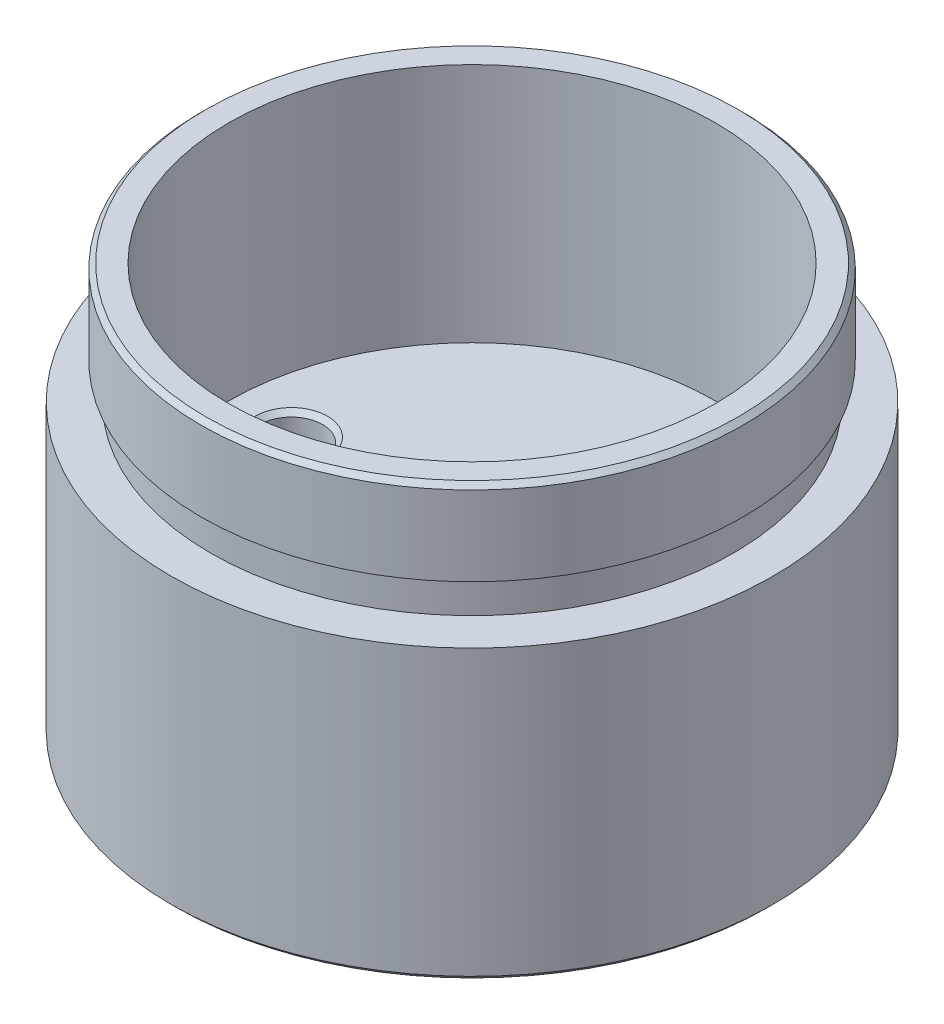
ISO-10303-21;
HEADER;
FILE_DESCRIPTION(('STEP AP214'),'2;1');
FILE_NAME('part.step','',(''),(''),'','','');
FILE_SCHEMA(('AUTOMOTIVE_DESIGN { 1 0 10303 214 1 1 1 1 }'));
ENDSEC;
DATA;
#1=APPLICATION_CONTEXT('core data for automotive mechanical design processes');
#2=APPLICATION_PROTOCOL_DEFINITION('international standard','automotive_design',2000,#1);
#3=PRODUCT_CONTEXT('',#1,'mechanical');
#4=PRODUCT('Part','Part','',(#3));
#5=PRODUCT_RELATED_PRODUCT_CATEGORY('part','',(#4));
#6=PRODUCT_DEFINITION_FORMATION('','',#4);
#7=PRODUCT_DEFINITION_CONTEXT('part definition',#1,'design');
#8=PRODUCT_DEFINITION('design','',#6,#7);
#9=PRODUCT_DEFINITION_SHAPE('','',#8);
#10=(LENGTH_UNIT() NAMED_UNIT(*) SI_UNIT(.MILLI.,.METRE.));
#11=(NAMED_UNIT(*) PLANE_ANGLE_UNIT() SI_UNIT($,.RADIAN.));
#12=(NAMED_UNIT(*) SI_UNIT($,.STERADIAN.) SOLID_ANGLE_UNIT());
#13=UNCERTAINTY_MEASURE_WITH_UNIT(LENGTH_MEASURE(1.E-05),#10,'distance_accuracy_value','');
#14=(GEOMETRIC_REPRESENTATION_CONTEXT(3) GLOBAL_UNCERTAINTY_ASSIGNED_CONTEXT((#13)) GLOBAL_UNIT_ASSIGNED_CONTEXT((#10,
#11,#12)) REPRESENTATION_CONTEXT('',''));
#15=CARTESIAN_POINT('',(0.,0.,0.));
#16=DIRECTION('',(0.,0.,1.));
#17=DIRECTION('',(1.,0.,0.));
#18=AXIS2_PLACEMENT_3D('',#15,#16,#17);
#19=CARTESIAN_POINT('',(0.,12.,0.));
#20=DIRECTION('',(0.,1.,0.));
#21=DIRECTION('',(0.,0.,1.));
#22=AXIS2_PLACEMENT_3D('',#19,#20,#21);
#23=CYLINDRICAL_SURFACE('',#22,10.85);
#24=CARTESIAN_POINT('',(0.,12.,0.));
#25=DIRECTION('',(0.,1.,0.));
#26=DIRECTION('',(0.,0.,1.));
#27=AXIS2_PLACEMENT_3D('',#24,#25,#26);
#28=CIRCLE('',#27,10.85);
#29=CARTESIAN_POINT('',(0.,12.,10.85));
#30=VERTEX_POINT('',#29);
#31=EDGE_CURVE('E87',#30,#30,#28,.T.);
#32=ORIENTED_EDGE('',*,*,#31,.T.);
#33=EDGE_LOOP('',(#32));
#34=FACE_BOUND('',#33,.T.);
#35=CARTESIAN_POINT('',(0.,13.5,0.));
#36=DIRECTION('',(0.,1.,0.));
#37=DIRECTION('',(0.,0.,1.));
#38=AXIS2_PLACEMENT_3D('',#35,#36,#37);
#39=CIRCLE('',#38,10.85);
#40=CARTESIAN_POINT('',(0.,13.5,10.85));
#41=VERTEX_POINT('',#40);
#42=EDGE_CURVE('E93',#41,#41,#39,.T.);
#43=ORIENTED_EDGE('',*,*,#42,.F.);
#44=EDGE_LOOP('',(#43));
#45=FACE_BOUND('',#44,.T.);
#46=ADVANCED_FACE('F34',(#34,#45),#23,.T.);
#47=CARTESIAN_POINT('',(0.,17.,0.));
#48=DIRECTION('',(0.,-1.,0.));
#49=DIRECTION('',(0.,0.,-1.));
#50=AXIS2_PLACEMENT_3D('',#47,#48,#49);
#51=CYLINDRICAL_SURFACE('',#50,12.5);
#52=CARTESIAN_POINT('',(0.,0.199999999999995,0.));
#53=DIRECTION('',(0.,1.,0.));
#54=DIRECTION('',(0.,0.,1.));
#55=AXIS2_PLACEMENT_3D('',#52,#53,#54);
#56=CIRCLE('',#55,12.5);
#57=CARTESIAN_POINT('',(0.,0.199999999999995,12.5));
#58=VERTEX_POINT('',#57);
#59=EDGE_CURVE('E45',#58,#58,#56,.T.);
#60=ORIENTED_EDGE('',*,*,#59,.T.);
#61=EDGE_LOOP('',(#60));
#62=FACE_BOUND('',#61,.T.);
#63=CARTESIAN_POINT('',(0.,12.,0.));
#64=DIRECTION('',(0.,1.,0.));
#65=DIRECTION('',(0.,0.,1.));
#66=AXIS2_PLACEMENT_3D('',#63,#64,#65);
#67=CIRCLE('',#66,12.5);
#68=CARTESIAN_POINT('',(0.,12.,12.5));
#69=VERTEX_POINT('',#68);
#70=EDGE_CURVE('E82',#69,#69,#67,.T.);
#71=ORIENTED_EDGE('',*,*,#70,.F.);
#72=EDGE_LOOP('',(#71));
#73=FACE_BOUND('',#72,.T.);
#74=ADVANCED_FACE('F101',(#62,#73),#51,.T.);
#75=CARTESIAN_POINT('',(0.,17.,0.));
#76=DIRECTION('',(0.,1.,0.));
#77=DIRECTION('',(0.,0.,1.));
#78=AXIS2_PLACEMENT_3D('',#75,#76,#77);
#79=PLANE('',#78);
#80=CARTESIAN_POINT('',(0.,17.,0.));
#81=DIRECTION('',(0.,1.,0.));
#82=DIRECTION('',(0.,0.,1.));
#83=AXIS2_PLACEMENT_3D('',#80,#81,#82);
#84=CIRCLE('',#83,11.05);
#85=CARTESIAN_POINT('',(0.,17.,11.05));
#86=VERTEX_POINT('',#85);
#87=EDGE_CURVE('E41',#86,#86,#84,.T.);
#88=ORIENTED_EDGE('',*,*,#87,.T.);
#89=EDGE_LOOP('',(#88));
#90=FACE_BOUND('',#89,.T.);
#91=CARTESIAN_POINT('',(0.,17.,0.));
#92=DIRECTION('',(0.,1.,0.));
#93=DIRECTION('',(0.,0.,1.));
#94=AXIS2_PLACEMENT_3D('',#91,#92,#93);
#95=CIRCLE('',#94,10.1);
#96=CARTESIAN_POINT('',(0.,17.,10.1));
#97=VERTEX_POINT('',#96);
#98=EDGE_CURVE('E79',#97,#97,#95,.T.);
#99=ORIENTED_EDGE('',*,*,#98,.F.);
#100=EDGE_LOOP('',(#99));
#101=FACE_BOUND('',#100,.T.);
#102=ADVANCED_FACE('F107',(#90,#101),#79,.T.);
#103=CARTESIAN_POINT('',(0.,0.,0.));
#104=DIRECTION('',(0.,1.,0.));
#105=DIRECTION('',(0.,0.,1.));
#106=AXIS2_PLACEMENT_3D('',#103,#104,#105);
#107=PLANE('',#106);
#108=CARTESIAN_POINT('',(7.5,0.,0.));
#109=DIRECTION('',(0.,1.,0.));
#110=DIRECTION('',(0.,0.,1.));
#111=AXIS2_PLACEMENT_3D('',#108,#109,#110);
#112=CIRCLE('',#111,1.5);
#113=CARTESIAN_POINT('',(7.5,0.,1.5));
#114=VERTEX_POINT('',#113);
#115=EDGE_CURVE('E49',#114,#114,#112,.T.);
#116=ORIENTED_EDGE('',*,*,#115,.T.);
#117=EDGE_LOOP('',(#116));
#118=FACE_BOUND('',#117,.T.);
#119=CARTESIAN_POINT('',(-7.5,0.,0.));
#120=DIRECTION('',(0.,1.,0.));
#121=DIRECTION('',(0.,0.,1.));
#122=AXIS2_PLACEMENT_3D('',#119,#120,#121);
#123=CIRCLE('',#122,1.5);
#124=CARTESIAN_POINT('',(-7.5,0.,1.5));
#125=VERTEX_POINT('',#124);
#126=EDGE_CURVE('E54',#125,#125,#123,.T.);
#127=ORIENTED_EDGE('',*,*,#126,.T.);
#128=EDGE_LOOP('',(#127));
#129=FACE_BOUND('',#128,.T.);
#130=CARTESIAN_POINT('',(0.,0.,0.));
#131=DIRECTION('',(0.,1.,0.));
#132=DIRECTION('',(0.,0.,1.));
#133=AXIS2_PLACEMENT_3D('',#130,#131,#132);
#134=CIRCLE('',#133,12.3);
#135=CARTESIAN_POINT('',(0.,0.,12.3));
#136=VERTEX_POINT('',#135);
#137=EDGE_CURVE('E57',#136,#136,#134,.F.);
#138=ORIENTED_EDGE('',*,*,#137,.T.);
#139=EDGE_LOOP('',(#138));
#140=FACE_BOUND('',#139,.T.);
#141=ADVANCED_FACE('F133',(#118,#129,#140),#107,.F.);
#142=CARTESIAN_POINT('',(0.,7.,0.));
#143=DIRECTION('',(0.,1.,0.));
#144=DIRECTION('',(0.,0.,1.));
#145=AXIS2_PLACEMENT_3D('',#142,#143,#144);
#146=CYLINDRICAL_SURFACE('',#145,10.1);
#147=CARTESIAN_POINT('',(0.,7.,0.));
#148=DIRECTION('',(0.,1.,0.));
#149=DIRECTION('',(0.,0.,1.));
#150=AXIS2_PLACEMENT_3D('',#147,#148,#149);
#151=CIRCLE('',#150,10.1);
#152=CARTESIAN_POINT('',(0.,7.,10.1));
#153=VERTEX_POINT('',#152);
#154=EDGE_CURVE('E78',#153,#153,#151,.T.);
#155=ORIENTED_EDGE('',*,*,#154,.F.);
#156=EDGE_LOOP('',(#155));
#157=FACE_BOUND('',#156,.T.);
#158=ORIENTED_EDGE('',*,*,#98,.T.);
#159=EDGE_LOOP('',(#158));
#160=FACE_BOUND('',#159,.T.);
#161=ADVANCED_FACE('F129',(#157,#160),#146,.F.);
#162=CARTESIAN_POINT('',(0.,7.,0.));
#163=DIRECTION('',(0.,1.,0.));
#164=DIRECTION('',(0.,0.,1.));
#165=AXIS2_PLACEMENT_3D('',#162,#163,#164);
#166=PLANE('',#165);
#167=CARTESIAN_POINT('',(-7.5,7.,0.));
#168=DIRECTION('',(0.,1.,0.));
#169=DIRECTION('',(0.,0.,1.));
#170=AXIS2_PLACEMENT_3D('',#167,#168,#169);
#171=CIRCLE('',#170,1.5);
#172=CARTESIAN_POINT('',(-7.5,7.,1.5));
#173=VERTEX_POINT('',#172);
#174=EDGE_CURVE('E66',#173,#173,#171,.F.);
#175=ORIENTED_EDGE('',*,*,#174,.T.);
#176=EDGE_LOOP('',(#175));
#177=FACE_BOUND('',#176,.T.);
#178=CARTESIAN_POINT('',(7.5,7.,0.));
#179=DIRECTION('',(0.,1.,0.));
#180=DIRECTION('',(0.,0.,1.));
#181=AXIS2_PLACEMENT_3D('',#178,#179,#180);
#182=CIRCLE('',#181,1.5);
#183=CARTESIAN_POINT('',(7.5,7.,1.5));
#184=VERTEX_POINT('',#183);
#185=EDGE_CURVE('E69',#184,#184,#182,.F.);
#186=ORIENTED_EDGE('',*,*,#185,.T.);
#187=EDGE_LOOP('',(#186));
#188=FACE_BOUND('',#187,.T.);
#189=ORIENTED_EDGE('',*,*,#154,.T.);
#190=EDGE_LOOP('',(#189));
#191=FACE_BOUND('',#190,.T.);
#192=ADVANCED_FACE('F125',(#177,#188,#191),#166,.T.);
#193=CARTESIAN_POINT('',(7.5,-3.,0.));
#194=DIRECTION('',(0.,1.,0.));
#195=DIRECTION('',(0.,0.,1.));
#196=AXIS2_PLACEMENT_3D('',#193,#194,#195);
#197=CYLINDRICAL_SURFACE('',#196,1.3);
#198=CARTESIAN_POINT('',(7.5,6.8,0.));
#199=DIRECTION('',(0.,1.,0.));
#200=DIRECTION('',(0.,0.,1.));
#201=AXIS2_PLACEMENT_3D('',#198,#199,#200);
#202=CIRCLE('',#201,1.3);
#203=CARTESIAN_POINT('',(7.5,6.8,1.3));
#204=VERTEX_POINT('',#203);
#205=EDGE_CURVE('E60',#204,#204,#202,.T.);
#206=ORIENTED_EDGE('',*,*,#205,.T.);
#207=EDGE_LOOP('',(#206));
#208=FACE_BOUND('',#207,.T.);
#209=CARTESIAN_POINT('',(7.5,0.199999999999997,0.));
#210=DIRECTION('',(0.,1.,0.));
#211=DIRECTION('',(0.,0.,1.));
#212=AXIS2_PLACEMENT_3D('',#209,#210,#211);
#213=CIRCLE('',#212,1.3);
#214=CARTESIAN_POINT('',(7.5,0.199999999999997,1.3));
#215=VERTEX_POINT('',#214);
#216=EDGE_CURVE('E63',#215,#215,#213,.F.);
#217=ORIENTED_EDGE('',*,*,#216,.T.);
#218=EDGE_LOOP('',(#217));
#219=FACE_BOUND('',#218,.T.);
#220=ADVANCED_FACE('F121',(#208,#219),#197,.F.);
#221=CARTESIAN_POINT('',(-7.5,-3.,0.));
#222=DIRECTION('',(0.,1.,0.));
#223=DIRECTION('',(0.,0.,1.));
#224=AXIS2_PLACEMENT_3D('',#221,#222,#223);
#225=CYLINDRICAL_SURFACE('',#224,1.3);
#226=CARTESIAN_POINT('',(-7.5,6.8,0.));
#227=DIRECTION('',(0.,1.,0.));
#228=DIRECTION('',(0.,0.,1.));
#229=AXIS2_PLACEMENT_3D('',#226,#227,#228);
#230=CIRCLE('',#229,1.3);
#231=CARTESIAN_POINT('',(-7.5,6.8,1.3));
#232=VERTEX_POINT('',#231);
#233=EDGE_CURVE('E72',#232,#232,#230,.T.);
#234=ORIENTED_EDGE('',*,*,#233,.T.);
#235=EDGE_LOOP('',(#234));
#236=FACE_BOUND('',#235,.T.);
#237=CARTESIAN_POINT('',(-7.5,0.199999999999997,0.));
#238=DIRECTION('',(0.,1.,0.));
#239=DIRECTION('',(0.,0.,1.));
#240=AXIS2_PLACEMENT_3D('',#237,#238,#239);
#241=CIRCLE('',#240,1.3);
#242=CARTESIAN_POINT('',(-7.5,0.199999999999997,1.3));
#243=VERTEX_POINT('',#242);
#244=EDGE_CURVE('E75',#243,#243,#241,.F.);
#245=ORIENTED_EDGE('',*,*,#244,.T.);
#246=EDGE_LOOP('',(#245));
#247=FACE_BOUND('',#246,.T.);
#248=ADVANCED_FACE('F117',(#236,#247),#225,.F.);
#249=CARTESIAN_POINT('',(0.,12.,0.));
#250=DIRECTION('',(0.,1.,0.));
#251=DIRECTION('',(0.,0.,1.));
#252=AXIS2_PLACEMENT_3D('',#249,#250,#251);
#253=PLANE('',#252);
#254=ORIENTED_EDGE('',*,*,#31,.F.);
#255=EDGE_LOOP('',(#254));
#256=FACE_BOUND('',#255,.T.);
#257=ORIENTED_EDGE('',*,*,#70,.T.);
#258=EDGE_LOOP('',(#257));
#259=FACE_BOUND('',#258,.T.);
#260=ADVANCED_FACE('F114',(#256,#259),#253,.T.);
#261=CARTESIAN_POINT('',(0.,13.5,0.));
#262=DIRECTION('',(0.,1.,0.));
#263=DIRECTION('',(0.,0.,1.));
#264=AXIS2_PLACEMENT_3D('',#261,#262,#263);
#265=CYLINDRICAL_SURFACE('',#264,11.25);
#266=CARTESIAN_POINT('',(0.,16.8,0.));
#267=DIRECTION('',(0.,1.,0.));
#268=DIRECTION('',(0.,0.,1.));
#269=AXIS2_PLACEMENT_3D('',#266,#267,#268);
#270=CIRCLE('',#269,11.25);
#271=CARTESIAN_POINT('',(0.,16.8,11.25));
#272=VERTEX_POINT('',#271);
#273=EDGE_CURVE('E10',#272,#272,#270,.F.);
#274=ORIENTED_EDGE('',*,*,#273,.T.);
#275=EDGE_LOOP('',(#274));
#276=FACE_BOUND('',#275,.T.);
#277=CARTESIAN_POINT('',(0.,13.5,0.));
#278=DIRECTION('',(0.,1.,0.));
#279=DIRECTION('',(0.,0.,1.));
#280=AXIS2_PLACEMENT_3D('',#277,#278,#279);
#281=CIRCLE('',#280,11.25);
#282=CARTESIAN_POINT('',(0.,13.5,11.25));
#283=VERTEX_POINT('',#282);
#284=EDGE_CURVE('E90',#283,#283,#281,.T.);
#285=ORIENTED_EDGE('',*,*,#284,.T.);
#286=EDGE_LOOP('',(#285));
#287=FACE_BOUND('',#286,.T.);
#288=ADVANCED_FACE('F112',(#276,#287),#265,.T.);
#289=CARTESIAN_POINT('',(0.,13.5,0.));
#290=DIRECTION('',(0.,1.,0.));
#291=DIRECTION('',(0.,0.,1.));
#292=AXIS2_PLACEMENT_3D('',#289,#290,#291);
#293=PLANE('',#292);
#294=ORIENTED_EDGE('',*,*,#42,.T.);
#295=EDGE_LOOP('',(#294));
#296=FACE_BOUND('',#295,.T.);
#297=ORIENTED_EDGE('',*,*,#284,.F.);
#298=EDGE_LOOP('',(#297));
#299=FACE_BOUND('',#298,.T.);
#300=ADVANCED_FACE('F97',(#296,#299),#293,.F.);
#301=CARTESIAN_POINT('',(-7.5,6.8,0.));
#302=DIRECTION('',(0.,1.,0.));
#303=DIRECTION('',(0.,0.,1.));
#304=AXIS2_PLACEMENT_3D('',#301,#302,#303);
#305=CONICAL_SURFACE('',#304,1.3,0.78539816339745);
#306=ORIENTED_EDGE('',*,*,#174,.F.);
#307=EDGE_LOOP('',(#306));
#308=FACE_BOUND('',#307,.T.);
#309=ORIENTED_EDGE('',*,*,#233,.F.);
#310=EDGE_LOOP('',(#309));
#311=FACE_BOUND('',#310,.T.);
#312=ADVANCED_FACE('F140',(#308,#311),#305,.F.);
#313=CARTESIAN_POINT('',(7.5,6.8,0.));
#314=DIRECTION('',(0.,1.,0.));
#315=DIRECTION('',(0.,0.,1.));
#316=AXIS2_PLACEMENT_3D('',#313,#314,#315);
#317=CONICAL_SURFACE('',#316,1.3,0.785398163397451);
#318=ORIENTED_EDGE('',*,*,#185,.F.);
#319=EDGE_LOOP('',(#318));
#320=FACE_BOUND('',#319,.T.);
#321=ORIENTED_EDGE('',*,*,#205,.F.);
#322=EDGE_LOOP('',(#321));
#323=FACE_BOUND('',#322,.T.);
#324=ADVANCED_FACE('F143',(#320,#323),#317,.F.);
#325=CARTESIAN_POINT('',(7.5,0.,0.));
#326=DIRECTION('',(0.,-1.,0.));
#327=DIRECTION('',(0.,0.,-1.));
#328=AXIS2_PLACEMENT_3D('',#325,#326,#327);
#329=CONICAL_SURFACE('',#328,1.5,0.78539816339745);
#330=ORIENTED_EDGE('',*,*,#216,.F.);
#331=EDGE_LOOP('',(#330));
#332=FACE_BOUND('',#331,.T.);
#333=ORIENTED_EDGE('',*,*,#115,.F.);
#334=EDGE_LOOP('',(#333));
#335=FACE_BOUND('',#334,.T.);
#336=ADVANCED_FACE('F147',(#332,#335),#329,.F.);
#337=CARTESIAN_POINT('',(-7.5,0.,0.));
#338=DIRECTION('',(0.,-1.,0.));
#339=DIRECTION('',(0.,0.,-1.));
#340=AXIS2_PLACEMENT_3D('',#337,#338,#339);
#341=CONICAL_SURFACE('',#340,1.5,0.78539816339745);
#342=ORIENTED_EDGE('',*,*,#244,.F.);
#343=EDGE_LOOP('',(#342));
#344=FACE_BOUND('',#343,.T.);
#345=ORIENTED_EDGE('',*,*,#126,.F.);
#346=EDGE_LOOP('',(#345));
#347=FACE_BOUND('',#346,.T.);
#348=ADVANCED_FACE('F151',(#344,#347),#341,.F.);
#349=CARTESIAN_POINT('',(0.,0.199999999999995,0.));
#350=DIRECTION('',(0.,1.,0.));
#351=DIRECTION('',(0.,0.,1.));
#352=AXIS2_PLACEMENT_3D('',#349,#350,#351);
#353=CONICAL_SURFACE('',#352,12.5,0.785398163397457);
#354=ORIENTED_EDGE('',*,*,#137,.F.);
#355=EDGE_LOOP('',(#354));
#356=FACE_BOUND('',#355,.T.);
#357=ORIENTED_EDGE('',*,*,#59,.F.);
#358=EDGE_LOOP('',(#357));
#359=FACE_BOUND('',#358,.T.);
#360=ADVANCED_FACE('F154',(#356,#359),#353,.T.);
#361=CARTESIAN_POINT('',(0.,17.,0.));
#362=DIRECTION('',(0.,-1.,0.));
#363=DIRECTION('',(0.,0.,-1.));
#364=AXIS2_PLACEMENT_3D('',#361,#362,#363);
#365=CONICAL_SURFACE('',#364,11.05,0.785398163397444);
#366=ORIENTED_EDGE('',*,*,#273,.F.);
#367=EDGE_LOOP('',(#366));
#368=FACE_BOUND('',#367,.T.);
#369=ORIENTED_EDGE('',*,*,#87,.F.);
#370=EDGE_LOOP('',(#369));
#371=FACE_BOUND('',#370,.T.);
#372=ADVANCED_FACE('F36',(#368,#371),#365,.T.);
#373=CLOSED_SHELL('',(#46,#74,#102,#141,#161,#192,#220,#248,#260,#288,#300,#312,#324,#336,#348,
#360,#372));
#374=MANIFOLD_SOLID_BREP('B2',#373);
#375=ADVANCED_BREP_SHAPE_REPRESENTATION('',(#18,#374),#14);
#376=SHAPE_DEFINITION_REPRESENTATION(#9,#375);
ENDSEC;
END-ISO-10303-21;
